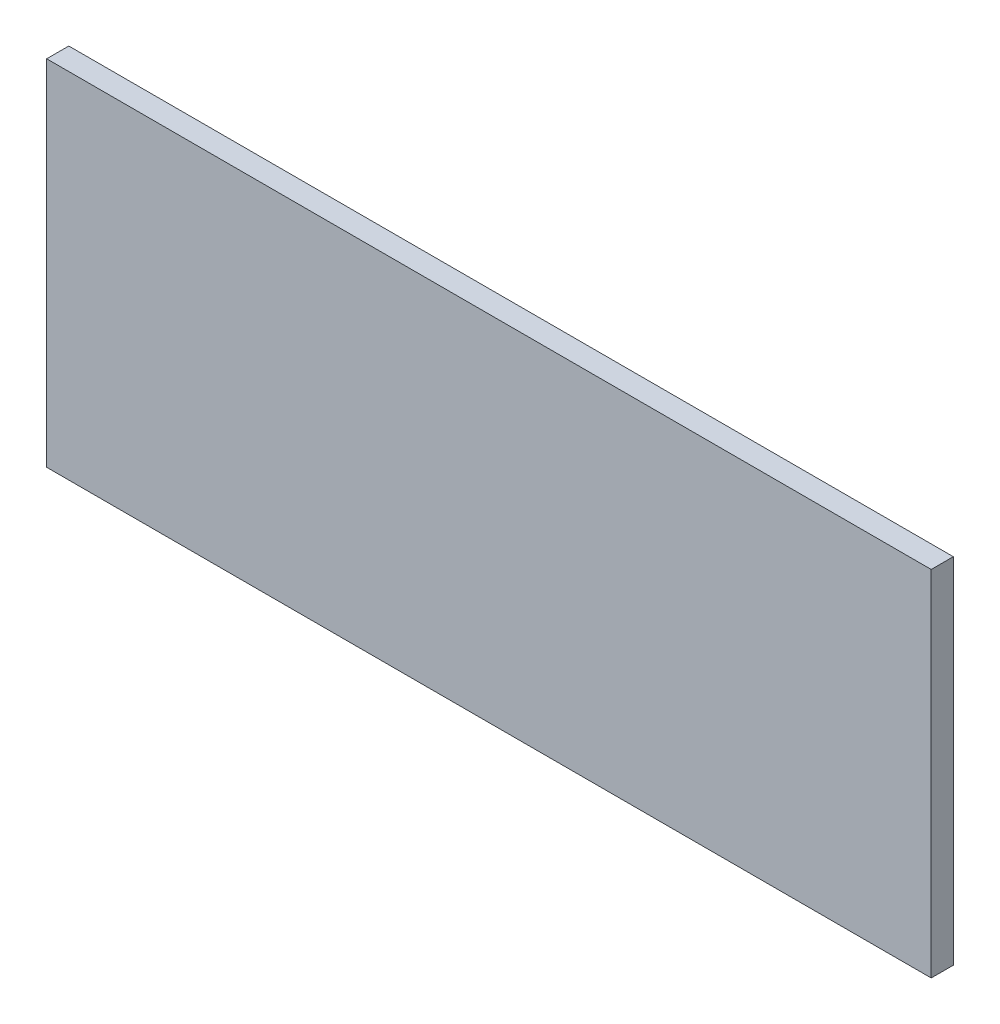
ISO-10303-21;
HEADER;
FILE_DESCRIPTION(('STEP AP214'),'2;1');
FILE_NAME('part.step','',(''),(''),'','','');
FILE_SCHEMA(('AUTOMOTIVE_DESIGN { 1 0 10303 214 1 1 1 1 }'));
ENDSEC;
DATA;
#1=APPLICATION_CONTEXT('core data for automotive mechanical design processes');
#2=APPLICATION_PROTOCOL_DEFINITION('international standard','automotive_design',2000,#1);
#3=PRODUCT_CONTEXT('',#1,'mechanical');
#4=PRODUCT('Part','Part','',(#3));
#5=PRODUCT_RELATED_PRODUCT_CATEGORY('part','',(#4));
#6=PRODUCT_DEFINITION_FORMATION('','',#4);
#7=PRODUCT_DEFINITION_CONTEXT('part definition',#1,'design');
#8=PRODUCT_DEFINITION('design','',#6,#7);
#9=PRODUCT_DEFINITION_SHAPE('','',#8);
#10=(LENGTH_UNIT() NAMED_UNIT(*) SI_UNIT(.MILLI.,.METRE.));
#11=(NAMED_UNIT(*) PLANE_ANGLE_UNIT() SI_UNIT($,.RADIAN.));
#12=(NAMED_UNIT(*) SI_UNIT($,.STERADIAN.) SOLID_ANGLE_UNIT());
#13=UNCERTAINTY_MEASURE_WITH_UNIT(LENGTH_MEASURE(1.E-05),#10,'distance_accuracy_value','');
#14=(GEOMETRIC_REPRESENTATION_CONTEXT(3) GLOBAL_UNCERTAINTY_ASSIGNED_CONTEXT((#13)) GLOBAL_UNIT_ASSIGNED_CONTEXT((#10,
#11,#12)) REPRESENTATION_CONTEXT('',''));
#15=CARTESIAN_POINT('',(0.,0.,0.));
#16=DIRECTION('',(0.,0.,1.));
#17=DIRECTION('',(1.,0.,0.));
#18=AXIS2_PLACEMENT_3D('',#15,#16,#17);
#19=CARTESIAN_POINT('',(0.,0.,5.));
#20=DIRECTION('',(-1.,0.,0.));
#21=DIRECTION('',(0.,-1.,0.));
#22=AXIS2_PLACEMENT_3D('',#19,#20,#21);
#23=PLANE('',#22);
#24=DIRECTION('',(0.,1.,0.));
#25=VECTOR('',#24,1.);
#26=CARTESIAN_POINT('',(0.,0.,0.));
#27=LINE('',#26,#25);
#28=CARTESIAN_POINT('',(0.,0.,0.));
#29=VERTEX_POINT('',#28);
#30=CARTESIAN_POINT('',(0.,80.,0.));
#31=VERTEX_POINT('',#30);
#32=EDGE_CURVE('E96',#29,#31,#27,.T.);
#33=ORIENTED_EDGE('',*,*,#32,.T.);
#34=DIRECTION('',(0.,0.,-1.));
#35=VECTOR('',#34,1.);
#36=CARTESIAN_POINT('',(0.,80.,5.));
#37=LINE('',#36,#35);
#38=CARTESIAN_POINT('',(0.,80.,5.));
#39=VERTEX_POINT('',#38);
#40=EDGE_CURVE('E11',#39,#31,#37,.T.);
#41=ORIENTED_EDGE('',*,*,#40,.F.);
#42=DIRECTION('',(0.,1.,0.));
#43=VECTOR('',#42,1.);
#44=CARTESIAN_POINT('',(0.,0.,5.));
#45=LINE('',#44,#43);
#46=CARTESIAN_POINT('',(0.,0.,5.));
#47=VERTEX_POINT('',#46);
#48=EDGE_CURVE('E84',#47,#39,#45,.T.);
#49=ORIENTED_EDGE('',*,*,#48,.F.);
#50=DIRECTION('',(0.,0.,-1.));
#51=VECTOR('',#50,1.);
#52=CARTESIAN_POINT('',(0.,0.,5.));
#53=LINE('',#52,#51);
#54=EDGE_CURVE('E92',#47,#29,#53,.T.);
#55=ORIENTED_EDGE('',*,*,#54,.T.);
#56=EDGE_LOOP('',(#33,#41,#49,#55));
#57=FACE_BOUND('',#56,.T.);
#58=ADVANCED_FACE('F33',(#57),#23,.F.);
#59=CARTESIAN_POINT('',(0.,80.,5.));
#60=DIRECTION('',(0.,-1.,0.));
#61=DIRECTION('',(1.,0.,0.));
#62=AXIS2_PLACEMENT_3D('',#59,#60,#61);
#63=PLANE('',#62);
#64=DIRECTION('',(-1.,0.,0.));
#65=VECTOR('',#64,1.);
#66=CARTESIAN_POINT('',(0.,80.,0.));
#67=LINE('',#66,#65);
#68=CARTESIAN_POINT('',(-200.,80.,0.));
#69=VERTEX_POINT('',#68);
#70=EDGE_CURVE('E88',#31,#69,#67,.T.);
#71=ORIENTED_EDGE('',*,*,#70,.T.);
#72=DIRECTION('',(0.,0.,-1.));
#73=VECTOR('',#72,1.);
#74=CARTESIAN_POINT('',(-200.,80.,5.));
#75=LINE('',#74,#73);
#76=CARTESIAN_POINT('',(-200.,80.,5.));
#77=VERTEX_POINT('',#76);
#78=EDGE_CURVE('E41',#77,#69,#75,.T.);
#79=ORIENTED_EDGE('',*,*,#78,.F.);
#80=DIRECTION('',(-1.,0.,0.));
#81=VECTOR('',#80,1.);
#82=CARTESIAN_POINT('',(0.,80.,5.));
#83=LINE('',#82,#81);
#84=EDGE_CURVE('E79',#39,#77,#83,.T.);
#85=ORIENTED_EDGE('',*,*,#84,.F.);
#86=ORIENTED_EDGE('',*,*,#40,.T.);
#87=EDGE_LOOP('',(#71,#79,#85,#86));
#88=FACE_BOUND('',#87,.T.);
#89=ADVANCED_FACE('F87',(#88),#63,.F.);
#90=CARTESIAN_POINT('',(-200.,0.,5.));
#91=DIRECTION('',(1.,0.,0.));
#92=DIRECTION('',(0.,0.,-1.));
#93=AXIS2_PLACEMENT_3D('',#90,#91,#92);
#94=PLANE('',#93);
#95=DIRECTION('',(0.,-1.,0.));
#96=VECTOR('',#95,1.);
#97=CARTESIAN_POINT('',(-200.,0.,0.));
#98=LINE('',#97,#96);
#99=CARTESIAN_POINT('',(-200.,0.,0.));
#100=VERTEX_POINT('',#99);
#101=EDGE_CURVE('E66',#69,#100,#98,.T.);
#102=ORIENTED_EDGE('',*,*,#101,.T.);
#103=DIRECTION('',(0.,0.,-1.));
#104=VECTOR('',#103,1.);
#105=CARTESIAN_POINT('',(-200.,0.,5.));
#106=LINE('',#105,#104);
#107=CARTESIAN_POINT('',(-200.,0.,5.));
#108=VERTEX_POINT('',#107);
#109=EDGE_CURVE('E89',#108,#100,#106,.T.);
#110=ORIENTED_EDGE('',*,*,#109,.F.);
#111=DIRECTION('',(0.,-1.,0.));
#112=VECTOR('',#111,1.);
#113=CARTESIAN_POINT('',(-200.,0.,5.));
#114=LINE('',#113,#112);
#115=EDGE_CURVE('E82',#77,#108,#114,.T.);
#116=ORIENTED_EDGE('',*,*,#115,.F.);
#117=ORIENTED_EDGE('',*,*,#78,.T.);
#118=EDGE_LOOP('',(#102,#110,#116,#117));
#119=FACE_BOUND('',#118,.T.);
#120=ADVANCED_FACE('F90',(#119),#94,.F.);
#121=CARTESIAN_POINT('',(0.,0.,5.));
#122=DIRECTION('',(0.,1.,0.));
#123=DIRECTION('',(0.,0.,1.));
#124=AXIS2_PLACEMENT_3D('',#121,#122,#123);
#125=PLANE('',#124);
#126=DIRECTION('',(1.,0.,0.));
#127=VECTOR('',#126,1.);
#128=CARTESIAN_POINT('',(0.,0.,0.));
#129=LINE('',#128,#127);
#130=EDGE_CURVE('E72',#100,#29,#129,.T.);
#131=ORIENTED_EDGE('',*,*,#130,.T.);
#132=ORIENTED_EDGE('',*,*,#54,.F.);
#133=DIRECTION('',(1.,0.,0.));
#134=VECTOR('',#133,1.);
#135=CARTESIAN_POINT('',(0.,0.,5.));
#136=LINE('',#135,#134);
#137=EDGE_CURVE('E49',#108,#47,#136,.T.);
#138=ORIENTED_EDGE('',*,*,#137,.F.);
#139=ORIENTED_EDGE('',*,*,#109,.T.);
#140=EDGE_LOOP('',(#131,#132,#138,#139));
#141=FACE_BOUND('',#140,.T.);
#142=ADVANCED_FACE('F103',(#141),#125,.F.);
#143=CARTESIAN_POINT('',(0.,0.,5.));
#144=DIRECTION('',(0.,0.,1.));
#145=DIRECTION('',(1.,0.,0.));
#146=AXIS2_PLACEMENT_3D('',#143,#144,#145);
#147=PLANE('',#146);
#148=ORIENTED_EDGE('',*,*,#48,.T.);
#149=ORIENTED_EDGE('',*,*,#84,.T.);
#150=ORIENTED_EDGE('',*,*,#115,.T.);
#151=ORIENTED_EDGE('',*,*,#137,.T.);
#152=EDGE_LOOP('',(#148,#149,#150,#151));
#153=FACE_BOUND('',#152,.T.);
#154=ADVANCED_FACE('F80',(#153),#147,.T.);
#155=CARTESIAN_POINT('',(0.,0.,0.));
#156=DIRECTION('',(0.,0.,1.));
#157=DIRECTION('',(1.,0.,0.));
#158=AXIS2_PLACEMENT_3D('',#155,#156,#157);
#159=PLANE('',#158);
#160=ORIENTED_EDGE('',*,*,#32,.F.);
#161=ORIENTED_EDGE('',*,*,#130,.F.);
#162=ORIENTED_EDGE('',*,*,#101,.F.);
#163=ORIENTED_EDGE('',*,*,#70,.F.);
#164=EDGE_LOOP('',(#160,#161,#162,#163));
#165=FACE_BOUND('',#164,.T.);
#166=ADVANCED_FACE('F106',(#165),#159,.F.);
#167=CLOSED_SHELL('',(#58,#89,#120,#142,#154,#166));
#168=MANIFOLD_SOLID_BREP('B2',#167);
#169=ADVANCED_BREP_SHAPE_REPRESENTATION('',(#18,#168),#14);
#170=SHAPE_DEFINITION_REPRESENTATION(#9,#169);
ENDSEC;
END-ISO-10303-21;
